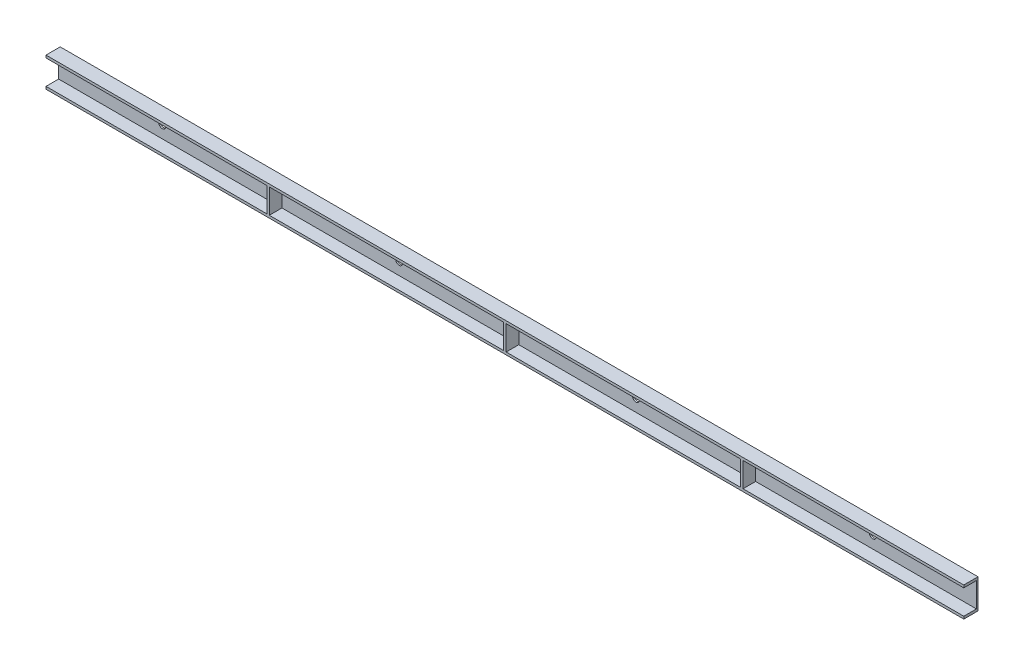
ISO-10303-21;
HEADER;
FILE_DESCRIPTION(('STEP AP214'),'2;1');
FILE_NAME('part.step','',(''),(''),'','','');
FILE_SCHEMA(('AUTOMOTIVE_DESIGN { 1 0 10303 214 1 1 1 1 }'));
ENDSEC;
DATA;
#1=APPLICATION_CONTEXT('core data for automotive mechanical design processes');
#2=APPLICATION_PROTOCOL_DEFINITION('international standard','automotive_design',2000,#1);
#3=PRODUCT_CONTEXT('',#1,'mechanical');
#4=PRODUCT('Part','Part','',(#3));
#5=PRODUCT_RELATED_PRODUCT_CATEGORY('part','',(#4));
#6=PRODUCT_DEFINITION_FORMATION('','',#4);
#7=PRODUCT_DEFINITION_CONTEXT('part definition',#1,'design');
#8=PRODUCT_DEFINITION('design','',#6,#7);
#9=PRODUCT_DEFINITION_SHAPE('','',#8);
#10=(LENGTH_UNIT() NAMED_UNIT(*) SI_UNIT(.MILLI.,.METRE.));
#11=(NAMED_UNIT(*) PLANE_ANGLE_UNIT() SI_UNIT($,.RADIAN.));
#12=(NAMED_UNIT(*) SI_UNIT($,.STERADIAN.) SOLID_ANGLE_UNIT());
#13=UNCERTAINTY_MEASURE_WITH_UNIT(LENGTH_MEASURE(1.E-05),#10,'distance_accuracy_value','');
#14=(GEOMETRIC_REPRESENTATION_CONTEXT(3) GLOBAL_UNCERTAINTY_ASSIGNED_CONTEXT((#13)) GLOBAL_UNIT_ASSIGNED_CONTEXT((#10,
#11,#12)) REPRESENTATION_CONTEXT('',''));
#15=CARTESIAN_POINT('',(0.,0.,0.));
#16=DIRECTION('',(0.,0.,1.));
#17=DIRECTION('',(1.,0.,0.));
#18=AXIS2_PLACEMENT_3D('',#15,#16,#17);
#19=CARTESIAN_POINT('',(0.,91.5,5.3));
#20=DIRECTION('',(0.,1.,0.));
#21=DIRECTION('',(0.,0.,1.));
#22=AXIS2_PLACEMENT_3D('',#19,#20,#21);
#23=PLANE('',#22);
#24=DIRECTION('',(-1.,0.,0.));
#25=VECTOR('',#24,1.);
#26=CARTESIAN_POINT('',(0.,91.5,5.3));
#27=LINE('',#26,#25);
#28=CARTESIAN_POINT('',(3700.,91.5,5.3));
#29=VERTEX_POINT('',#28);
#30=CARTESIAN_POINT('',(2954.25,91.5,5.3));
#31=VERTEX_POINT('',#30);
#32=EDGE_CURVE('E198',#29,#31,#27,.T.);
#33=ORIENTED_EDGE('',*,*,#32,.F.);
#34=DIRECTION('',(0.,0.,1.));
#35=VECTOR('',#34,1.);
#36=CARTESIAN_POINT('',(3700.,91.5,5.3));
#37=LINE('',#36,#35);
#38=CARTESIAN_POINT('',(3700.,91.5,48.));
#39=VERTEX_POINT('',#38);
#40=EDGE_CURVE('E347',#29,#39,#37,.T.);
#41=ORIENTED_EDGE('',*,*,#40,.T.);
#42=DIRECTION('',(-1.,0.,0.));
#43=VECTOR('',#42,1.);
#44=CARTESIAN_POINT('',(0.,91.5,48.));
#45=LINE('',#44,#43);
#46=CARTESIAN_POINT('',(2954.25,91.5,48.));
#47=VERTEX_POINT('',#46);
#48=EDGE_CURVE('E196',#39,#47,#45,.T.);
#49=ORIENTED_EDGE('',*,*,#48,.T.);
#50=DIRECTION('',(0.,0.,-1.));
#51=VECTOR('',#50,1.);
#52=CARTESIAN_POINT('',(2954.25,91.5,48.));
#53=LINE('',#52,#51);
#54=EDGE_CURVE('E293',#47,#31,#53,.T.);
#55=ORIENTED_EDGE('',*,*,#54,.T.);
#56=EDGE_LOOP('',(#33,#41,#49,#55));
#57=FACE_BOUND('',#56,.T.);
#58=ADVANCED_FACE('F32',(#57),#23,.F.);
#59=CARTESIAN_POINT('',(0.,8.50000000000001,5.3));
#60=DIRECTION('',(0.,-1.,0.));
#61=DIRECTION('',(1.,0.,0.));
#62=AXIS2_PLACEMENT_3D('',#59,#60,#61);
#63=PLANE('',#62);
#64=DIRECTION('',(1.,0.,0.));
#65=VECTOR('',#64,1.);
#66=CARTESIAN_POINT('',(0.,8.50000000000001,48.));
#67=LINE('',#66,#65);
#68=CARTESIAN_POINT('',(2954.25,8.5,48.));
#69=VERTEX_POINT('',#68);
#70=CARTESIAN_POINT('',(3700.,8.50000000000001,48.));
#71=VERTEX_POINT('',#70);
#72=EDGE_CURVE('E236',#69,#71,#67,.T.);
#73=ORIENTED_EDGE('',*,*,#72,.T.);
#74=DIRECTION('',(0.,0.,-1.));
#75=VECTOR('',#74,1.);
#76=CARTESIAN_POINT('',(3700.,8.5,5.3));
#77=LINE('',#76,#75);
#78=CARTESIAN_POINT('',(3700.,8.5,5.3));
#79=VERTEX_POINT('',#78);
#80=EDGE_CURVE('E172',#71,#79,#77,.T.);
#81=ORIENTED_EDGE('',*,*,#80,.T.);
#82=DIRECTION('',(1.,0.,0.));
#83=VECTOR('',#82,1.);
#84=CARTESIAN_POINT('',(0.,8.50000000000001,5.3));
#85=LINE('',#84,#83);
#86=CARTESIAN_POINT('',(2954.25,8.5,5.3));
#87=VERTEX_POINT('',#86);
#88=EDGE_CURVE('E214',#87,#79,#85,.T.);
#89=ORIENTED_EDGE('',*,*,#88,.F.);
#90=DIRECTION('',(0.,0.,-1.));
#91=VECTOR('',#90,1.);
#92=CARTESIAN_POINT('',(2954.25,8.50000000000001,48.));
#93=LINE('',#92,#91);
#94=EDGE_CURVE('E290',#69,#87,#93,.T.);
#95=ORIENTED_EDGE('',*,*,#94,.F.);
#96=EDGE_LOOP('',(#73,#81,#89,#95));
#97=FACE_BOUND('',#96,.T.);
#98=ADVANCED_FACE('F391',(#97),#63,.F.);
#99=CARTESIAN_POINT('',(0.,8.50000000000001,5.3));
#100=DIRECTION('',(0.,0.,1.));
#101=DIRECTION('',(1.,0.,0.));
#102=AXIS2_PLACEMENT_3D('',#99,#100,#101);
#103=PLANE('',#102);
#104=DIRECTION('',(0.,-1.,0.));
#105=VECTOR('',#104,1.);
#106=CARTESIAN_POINT('',(3700.,8.50000000000001,5.3));
#107=LINE('',#106,#105);
#108=EDGE_CURVE('E177',#29,#79,#107,.T.);
#109=ORIENTED_EDGE('',*,*,#108,.F.);
#110=ORIENTED_EDGE('',*,*,#32,.T.);
#111=DIRECTION('',(0.,1.,0.));
#112=VECTOR('',#111,1.);
#113=CARTESIAN_POINT('',(2954.25,91.5,5.3));
#114=LINE('',#113,#112);
#115=EDGE_CURVE('E299',#87,#31,#114,.T.);
#116=ORIENTED_EDGE('',*,*,#115,.F.);
#117=ORIENTED_EDGE('',*,*,#88,.T.);
#118=EDGE_LOOP('',(#109,#110,#116,#117));
#119=FACE_BOUND('',#118,.T.);
#120=CARTESIAN_POINT('',(3350.,50.,5.3));
#121=DIRECTION('',(0.,0.,1.));
#122=DIRECTION('',(1.,0.,0.));
#123=AXIS2_PLACEMENT_3D('',#120,#121,#122);
#124=CIRCLE('',#123,11.4999999999997);
#125=CARTESIAN_POINT('',(3361.5,50.,5.3));
#126=VERTEX_POINT('',#125);
#127=EDGE_CURVE('E306',#126,#126,#124,.T.);
#128=ORIENTED_EDGE('',*,*,#127,.F.);
#129=EDGE_LOOP('',(#128));
#130=FACE_BOUND('',#129,.T.);
#131=ADVANCED_FACE('F398',(#119,#130),#103,.T.);
#132=DIRECTION('',(0.,0.,-1.));
#133=VECTOR('',#132,1.);
#134=CARTESIAN_POINT('',(2945.75,91.5,48.));
#135=LINE('',#134,#133);
#136=CARTESIAN_POINT('',(2945.75,91.5,48.));
#137=VERTEX_POINT('',#136);
#138=CARTESIAN_POINT('',(2945.75,91.5,5.3));
#139=VERTEX_POINT('',#138);
#140=EDGE_CURVE('E295',#137,#139,#135,.T.);
#141=ORIENTED_EDGE('',*,*,#140,.F.);
#142=CARTESIAN_POINT('',(2154.25,91.5,48.));
#143=VERTEX_POINT('',#142);
#144=EDGE_CURVE('E223',#137,#143,#45,.T.);
#145=ORIENTED_EDGE('',*,*,#144,.T.);
#146=DIRECTION('',(0.,0.,-1.));
#147=VECTOR('',#146,1.);
#148=CARTESIAN_POINT('',(2154.25,91.5,48.));
#149=LINE('',#148,#147);
#150=CARTESIAN_POINT('',(2154.25,91.5,5.3));
#151=VERTEX_POINT('',#150);
#152=EDGE_CURVE('E270',#143,#151,#149,.T.);
#153=ORIENTED_EDGE('',*,*,#152,.T.);
#154=EDGE_CURVE('E199',#139,#151,#27,.T.);
#155=ORIENTED_EDGE('',*,*,#154,.F.);
#156=EDGE_LOOP('',(#141,#145,#153,#155));
#157=FACE_BOUND('',#156,.T.);
#158=ADVANCED_FACE('F393',(#157),#23,.F.);
#159=DIRECTION('',(0.,0.,-1.));
#160=VECTOR('',#159,1.);
#161=CARTESIAN_POINT('',(2945.75,8.50000000000001,48.));
#162=LINE('',#161,#160);
#163=CARTESIAN_POINT('',(2945.75,8.5,48.));
#164=VERTEX_POINT('',#163);
#165=CARTESIAN_POINT('',(2945.75,8.5,5.3));
#166=VERTEX_POINT('',#165);
#167=EDGE_CURVE('E284',#164,#166,#162,.T.);
#168=ORIENTED_EDGE('',*,*,#167,.T.);
#169=CARTESIAN_POINT('',(2154.25,8.5,5.3));
#170=VERTEX_POINT('',#169);
#171=EDGE_CURVE('E218',#170,#166,#85,.T.);
#172=ORIENTED_EDGE('',*,*,#171,.F.);
#173=DIRECTION('',(0.,0.,-1.));
#174=VECTOR('',#173,1.);
#175=CARTESIAN_POINT('',(2154.25,8.50000000000001,48.));
#176=LINE('',#175,#174);
#177=CARTESIAN_POINT('',(2154.25,8.5,48.));
#178=VERTEX_POINT('',#177);
#179=EDGE_CURVE('E267',#178,#170,#176,.T.);
#180=ORIENTED_EDGE('',*,*,#179,.F.);
#181=EDGE_CURVE('E240',#178,#164,#67,.T.);
#182=ORIENTED_EDGE('',*,*,#181,.T.);
#183=EDGE_LOOP('',(#168,#172,#180,#182));
#184=FACE_BOUND('',#183,.T.);
#185=ADVANCED_FACE('F400',(#184),#63,.F.);
#186=CARTESIAN_POINT('',(2550.,50.,5.3));
#187=DIRECTION('',(0.,0.,1.));
#188=DIRECTION('',(1.,0.,0.));
#189=AXIS2_PLACEMENT_3D('',#186,#187,#188);
#190=CIRCLE('',#189,11.4999999999997);
#191=CARTESIAN_POINT('',(2561.5,50.,5.3));
#192=VERTEX_POINT('',#191);
#193=EDGE_CURVE('E315',#192,#192,#190,.T.);
#194=ORIENTED_EDGE('',*,*,#193,.F.);
#195=EDGE_LOOP('',(#194));
#196=FACE_BOUND('',#195,.T.);
#197=ORIENTED_EDGE('',*,*,#171,.T.);
#198=DIRECTION('',(0.,-1.,0.));
#199=VECTOR('',#198,1.);
#200=CARTESIAN_POINT('',(2945.75,91.5,5.3));
#201=LINE('',#200,#199);
#202=EDGE_CURVE('E303',#139,#166,#201,.T.);
#203=ORIENTED_EDGE('',*,*,#202,.F.);
#204=ORIENTED_EDGE('',*,*,#154,.T.);
#205=DIRECTION('',(0.,1.,0.));
#206=VECTOR('',#205,1.);
#207=CARTESIAN_POINT('',(2154.25,91.5,5.3));
#208=LINE('',#207,#206);
#209=EDGE_CURVE('E277',#170,#151,#208,.T.);
#210=ORIENTED_EDGE('',*,*,#209,.F.);
#211=EDGE_LOOP('',(#197,#203,#204,#210));
#212=FACE_BOUND('',#211,.T.);
#213=ADVANCED_FACE('F415',(#196,#212),#103,.T.);
#214=DIRECTION('',(0.,0.,-1.));
#215=VECTOR('',#214,1.);
#216=CARTESIAN_POINT('',(2145.75,91.5,48.));
#217=LINE('',#216,#215);
#218=CARTESIAN_POINT('',(2145.75,91.5,48.));
#219=VERTEX_POINT('',#218);
#220=CARTESIAN_POINT('',(2145.75,91.5,5.3));
#221=VERTEX_POINT('',#220);
#222=EDGE_CURVE('E273',#219,#221,#217,.T.);
#223=ORIENTED_EDGE('',*,*,#222,.F.);
#224=CARTESIAN_POINT('',(1354.25,91.5,48.));
#225=VERTEX_POINT('',#224);
#226=EDGE_CURVE('E229',#219,#225,#45,.T.);
#227=ORIENTED_EDGE('',*,*,#226,.T.);
#228=DIRECTION('',(0.,0.,-1.));
#229=VECTOR('',#228,1.);
#230=CARTESIAN_POINT('',(1354.25,91.5,48.));
#231=LINE('',#230,#229);
#232=CARTESIAN_POINT('',(1354.25,91.5,5.3));
#233=VERTEX_POINT('',#232);
#234=EDGE_CURVE('E247',#225,#233,#231,.T.);
#235=ORIENTED_EDGE('',*,*,#234,.T.);
#236=EDGE_CURVE('E206',#221,#233,#27,.T.);
#237=ORIENTED_EDGE('',*,*,#236,.F.);
#238=EDGE_LOOP('',(#223,#227,#235,#237));
#239=FACE_BOUND('',#238,.T.);
#240=ADVANCED_FACE('F405',(#239),#23,.F.);
#241=DIRECTION('',(0.,0.,-1.));
#242=VECTOR('',#241,1.);
#243=CARTESIAN_POINT('',(2145.75,8.50000000000001,48.));
#244=LINE('',#243,#242);
#245=CARTESIAN_POINT('',(2145.75,8.5,48.));
#246=VERTEX_POINT('',#245);
#247=CARTESIAN_POINT('',(2145.75,8.5,5.3));
#248=VERTEX_POINT('',#247);
#249=EDGE_CURVE('E262',#246,#248,#244,.T.);
#250=ORIENTED_EDGE('',*,*,#249,.T.);
#251=CARTESIAN_POINT('',(1354.25,8.50000000000001,5.3));
#252=VERTEX_POINT('',#251);
#253=EDGE_CURVE('E213',#252,#248,#85,.T.);
#254=ORIENTED_EDGE('',*,*,#253,.F.);
#255=DIRECTION('',(0.,0.,-1.));
#256=VECTOR('',#255,1.);
#257=CARTESIAN_POINT('',(1354.25,8.50000000000001,48.));
#258=LINE('',#257,#256);
#259=CARTESIAN_POINT('',(1354.25,8.50000000000001,48.));
#260=VERTEX_POINT('',#259);
#261=EDGE_CURVE('E243',#260,#252,#258,.T.);
#262=ORIENTED_EDGE('',*,*,#261,.F.);
#263=EDGE_CURVE('E235',#260,#246,#67,.T.);
#264=ORIENTED_EDGE('',*,*,#263,.T.);
#265=EDGE_LOOP('',(#250,#254,#262,#264));
#266=FACE_BOUND('',#265,.T.);
#267=ADVANCED_FACE('F413',(#266),#63,.F.);
#268=CARTESIAN_POINT('',(1750.,50.,5.3));
#269=DIRECTION('',(0.,0.,1.));
#270=DIRECTION('',(1.,0.,0.));
#271=AXIS2_PLACEMENT_3D('',#268,#269,#270);
#272=CIRCLE('',#271,11.4999999999997);
#273=CARTESIAN_POINT('',(1761.5,50.,5.3));
#274=VERTEX_POINT('',#273);
#275=EDGE_CURVE('E321',#274,#274,#272,.T.);
#276=ORIENTED_EDGE('',*,*,#275,.F.);
#277=EDGE_LOOP('',(#276));
#278=FACE_BOUND('',#277,.T.);
#279=ORIENTED_EDGE('',*,*,#253,.T.);
#280=DIRECTION('',(0.,-1.,0.));
#281=VECTOR('',#280,1.);
#282=CARTESIAN_POINT('',(2145.75,91.5,5.3));
#283=LINE('',#282,#281);
#284=EDGE_CURVE('E281',#221,#248,#283,.T.);
#285=ORIENTED_EDGE('',*,*,#284,.F.);
#286=ORIENTED_EDGE('',*,*,#236,.T.);
#287=DIRECTION('',(0.,1.,0.));
#288=VECTOR('',#287,1.);
#289=CARTESIAN_POINT('',(1354.25,91.5,5.3));
#290=LINE('',#289,#288);
#291=EDGE_CURVE('E256',#252,#233,#290,.T.);
#292=ORIENTED_EDGE('',*,*,#291,.F.);
#293=EDGE_LOOP('',(#279,#285,#286,#292));
#294=FACE_BOUND('',#293,.T.);
#295=ADVANCED_FACE('F407',(#278,#294),#103,.T.);
#296=CARTESIAN_POINT('',(1345.75,91.5,48.));
#297=VERTEX_POINT('',#296);
#298=CARTESIAN_POINT('',(600.,91.5,48.));
#299=VERTEX_POINT('',#298);
#300=EDGE_CURVE('E224',#297,#299,#45,.T.);
#301=ORIENTED_EDGE('',*,*,#300,.T.);
#302=DIRECTION('',(0.,0.,-1.));
#303=VECTOR('',#302,1.);
#304=CARTESIAN_POINT('',(600.,91.5,5.3));
#305=LINE('',#304,#303);
#306=CARTESIAN_POINT('',(600.,91.5,5.3));
#307=VERTEX_POINT('',#306);
#308=EDGE_CURVE('E333',#299,#307,#305,.T.);
#309=ORIENTED_EDGE('',*,*,#308,.T.);
#310=CARTESIAN_POINT('',(1345.75,91.5,5.3));
#311=VERTEX_POINT('',#310);
#312=EDGE_CURVE('E201',#311,#307,#27,.T.);
#313=ORIENTED_EDGE('',*,*,#312,.F.);
#314=DIRECTION('',(0.,0.,-1.));
#315=VECTOR('',#314,1.);
#316=CARTESIAN_POINT('',(1345.75,91.5,48.));
#317=LINE('',#316,#315);
#318=EDGE_CURVE('E252',#297,#311,#317,.T.);
#319=ORIENTED_EDGE('',*,*,#318,.F.);
#320=EDGE_LOOP('',(#301,#309,#313,#319));
#321=FACE_BOUND('',#320,.T.);
#322=ADVANCED_FACE('F394',(#321),#23,.F.);
#323=CARTESIAN_POINT('',(600.,8.50000000000001,5.3));
#324=VERTEX_POINT('',#323);
#325=CARTESIAN_POINT('',(1345.75,8.50000000000001,5.3));
#326=VERTEX_POINT('',#325);
#327=EDGE_CURVE('E209',#324,#326,#85,.T.);
#328=ORIENTED_EDGE('',*,*,#327,.F.);
#329=DIRECTION('',(0.,0.,1.));
#330=VECTOR('',#329,1.);
#331=CARTESIAN_POINT('',(600.,8.50000000000001,5.3));
#332=LINE('',#331,#330);
#333=CARTESIAN_POINT('',(600.,8.50000000000001,48.));
#334=VERTEX_POINT('',#333);
#335=EDGE_CURVE('E335',#324,#334,#332,.T.);
#336=ORIENTED_EDGE('',*,*,#335,.T.);
#337=CARTESIAN_POINT('',(1345.75,8.50000000000001,48.));
#338=VERTEX_POINT('',#337);
#339=EDGE_CURVE('E231',#334,#338,#67,.T.);
#340=ORIENTED_EDGE('',*,*,#339,.T.);
#341=DIRECTION('',(0.,0.,-1.));
#342=VECTOR('',#341,1.);
#343=CARTESIAN_POINT('',(1345.75,8.50000000000001,48.));
#344=LINE('',#343,#342);
#345=EDGE_CURVE('E241',#338,#326,#344,.T.);
#346=ORIENTED_EDGE('',*,*,#345,.T.);
#347=EDGE_LOOP('',(#328,#336,#340,#346));
#348=FACE_BOUND('',#347,.T.);
#349=ADVANCED_FACE('F401',(#348),#63,.F.);
#350=DIRECTION('',(0.,1.,0.));
#351=VECTOR('',#350,1.);
#352=CARTESIAN_POINT('',(600.,8.50000000000001,5.3));
#353=LINE('',#352,#351);
#354=EDGE_CURVE('E337',#324,#307,#353,.T.);
#355=ORIENTED_EDGE('',*,*,#354,.F.);
#356=ORIENTED_EDGE('',*,*,#327,.T.);
#357=DIRECTION('',(0.,-1.,0.));
#358=VECTOR('',#357,1.);
#359=CARTESIAN_POINT('',(1345.75,91.5,5.3));
#360=LINE('',#359,#358);
#361=EDGE_CURVE('E260',#311,#326,#360,.T.);
#362=ORIENTED_EDGE('',*,*,#361,.F.);
#363=ORIENTED_EDGE('',*,*,#312,.T.);
#364=EDGE_LOOP('',(#355,#356,#362,#363));
#365=FACE_BOUND('',#364,.T.);
#366=CARTESIAN_POINT('',(949.999999999998,50.,5.3));
#367=DIRECTION('',(0.,0.,1.));
#368=DIRECTION('',(1.,0.,0.));
#369=AXIS2_PLACEMENT_3D('',#366,#367,#368);
#370=CIRCLE('',#369,11.4999999999997);
#371=CARTESIAN_POINT('',(961.499999999998,50.,5.3));
#372=VERTEX_POINT('',#371);
#373=EDGE_CURVE('E327',#372,#372,#370,.T.);
#374=ORIENTED_EDGE('',*,*,#373,.F.);
#375=EDGE_LOOP('',(#374));
#376=FACE_BOUND('',#375,.T.);
#377=ADVANCED_FACE('F412',(#365,#376),#103,.T.);
#378=CARTESIAN_POINT('',(0.,0.,48.));
#379=DIRECTION('',(0.,1.,0.));
#380=DIRECTION('',(0.,0.,1.));
#381=AXIS2_PLACEMENT_3D('',#378,#379,#380);
#382=PLANE('',#381);
#383=DIRECTION('',(1.,0.,0.));
#384=VECTOR('',#383,1.);
#385=CARTESIAN_POINT('',(0.,0.,0.));
#386=LINE('',#385,#384);
#387=CARTESIAN_POINT('',(600.,0.,0.));
#388=VERTEX_POINT('',#387);
#389=CARTESIAN_POINT('',(3700.,0.,0.));
#390=VERTEX_POINT('',#389);
#391=EDGE_CURVE('E185',#388,#390,#386,.T.);
#392=ORIENTED_EDGE('',*,*,#391,.T.);
#393=DIRECTION('',(0.,0.,1.));
#394=VECTOR('',#393,1.);
#395=CARTESIAN_POINT('',(3700.,0.,48.));
#396=LINE('',#395,#394);
#397=CARTESIAN_POINT('',(3700.,0.,48.));
#398=VERTEX_POINT('',#397);
#399=EDGE_CURVE('E49',#390,#398,#396,.T.);
#400=ORIENTED_EDGE('',*,*,#399,.T.);
#401=DIRECTION('',(1.,0.,0.));
#402=VECTOR('',#401,1.);
#403=CARTESIAN_POINT('',(0.,0.,48.));
#404=LINE('',#403,#402);
#405=CARTESIAN_POINT('',(600.,0.,48.));
#406=VERTEX_POINT('',#405);
#407=EDGE_CURVE('E41',#406,#398,#404,.T.);
#408=ORIENTED_EDGE('',*,*,#407,.F.);
#409=DIRECTION('',(0.,0.,-1.));
#410=VECTOR('',#409,1.);
#411=CARTESIAN_POINT('',(600.,0.,0.));
#412=LINE('',#411,#410);
#413=EDGE_CURVE('E346',#406,#388,#412,.T.);
#414=ORIENTED_EDGE('',*,*,#413,.T.);
#415=EDGE_LOOP('',(#392,#400,#408,#414));
#416=FACE_BOUND('',#415,.T.);
#417=ADVANCED_FACE('F34',(#416),#382,.F.);
#418=CARTESIAN_POINT('',(0.,100.,48.));
#419=DIRECTION('',(0.,-1.,0.));
#420=DIRECTION('',(0.,0.,-1.));
#421=AXIS2_PLACEMENT_3D('',#418,#419,#420);
#422=PLANE('',#421);
#423=DIRECTION('',(-1.,0.,0.));
#424=VECTOR('',#423,1.);
#425=CARTESIAN_POINT('',(0.,100.,48.));
#426=LINE('',#425,#424);
#427=CARTESIAN_POINT('',(3700.,100.,48.));
#428=VERTEX_POINT('',#427);
#429=CARTESIAN_POINT('',(600.,100.,48.));
#430=VERTEX_POINT('',#429);
#431=EDGE_CURVE('E11',#428,#430,#426,.T.);
#432=ORIENTED_EDGE('',*,*,#431,.F.);
#433=DIRECTION('',(0.,0.,1.));
#434=VECTOR('',#433,1.);
#435=CARTESIAN_POINT('',(3700.,100.,48.));
#436=LINE('',#435,#434);
#437=CARTESIAN_POINT('',(3700.,100.,0.));
#438=VERTEX_POINT('',#437);
#439=EDGE_CURVE('E187',#438,#428,#436,.T.);
#440=ORIENTED_EDGE('',*,*,#439,.F.);
#441=DIRECTION('',(-1.,0.,0.));
#442=VECTOR('',#441,1.);
#443=CARTESIAN_POINT('',(0.,100.,0.));
#444=LINE('',#443,#442);
#445=CARTESIAN_POINT('',(600.,100.,0.));
#446=VERTEX_POINT('',#445);
#447=EDGE_CURVE('E36',#438,#446,#444,.T.);
#448=ORIENTED_EDGE('',*,*,#447,.T.);
#449=DIRECTION('',(0.,0.,-1.));
#450=VECTOR('',#449,1.);
#451=CARTESIAN_POINT('',(600.,100.,0.));
#452=LINE('',#451,#450);
#453=EDGE_CURVE('E344',#430,#446,#452,.T.);
#454=ORIENTED_EDGE('',*,*,#453,.F.);
#455=EDGE_LOOP('',(#432,#440,#448,#454));
#456=FACE_BOUND('',#455,.T.);
#457=ADVANCED_FACE('F357',(#456),#422,.F.);
#458=CARTESIAN_POINT('',(0.,100.,48.));
#459=DIRECTION('',(0.,0.,-1.));
#460=DIRECTION('',(-1.,0.,0.));
#461=AXIS2_PLACEMENT_3D('',#458,#459,#460);
#462=PLANE('',#461);
#463=ORIENTED_EDGE('',*,*,#407,.T.);
#464=DIRECTION('',(0.,1.,0.));
#465=VECTOR('',#464,1.);
#466=CARTESIAN_POINT('',(3700.,0.,48.));
#467=LINE('',#466,#465);
#468=EDGE_CURVE('E169',#398,#71,#467,.T.);
#469=ORIENTED_EDGE('',*,*,#468,.T.);
#470=ORIENTED_EDGE('',*,*,#72,.F.);
#471=DIRECTION('',(0.,1.,0.));
#472=VECTOR('',#471,1.);
#473=CARTESIAN_POINT('',(2954.25,91.5,48.));
#474=LINE('',#473,#472);
#475=EDGE_CURVE('E298',#69,#47,#474,.T.);
#476=ORIENTED_EDGE('',*,*,#475,.T.);
#477=ORIENTED_EDGE('',*,*,#48,.F.);
#478=EDGE_CURVE('E178',#39,#428,#467,.T.);
#479=ORIENTED_EDGE('',*,*,#478,.T.);
#480=ORIENTED_EDGE('',*,*,#431,.T.);
#481=DIRECTION('',(0.,1.,0.));
#482=VECTOR('',#481,1.);
#483=CARTESIAN_POINT('',(600.,0.,48.));
#484=LINE('',#483,#482);
#485=EDGE_CURVE('E341',#299,#430,#484,.T.);
#486=ORIENTED_EDGE('',*,*,#485,.F.);
#487=ORIENTED_EDGE('',*,*,#300,.F.);
#488=DIRECTION('',(0.,-1.,0.));
#489=VECTOR('',#488,1.);
#490=CARTESIAN_POINT('',(1345.75,91.5,48.));
#491=LINE('',#490,#489);
#492=EDGE_CURVE('E259',#297,#338,#491,.T.);
#493=ORIENTED_EDGE('',*,*,#492,.T.);
#494=ORIENTED_EDGE('',*,*,#339,.F.);
#495=EDGE_CURVE('E193',#406,#334,#484,.T.);
#496=ORIENTED_EDGE('',*,*,#495,.F.);
#497=EDGE_LOOP('',(#463,#469,#470,#476,#477,#479,#480,#486,#487,#493,#494,#496));
#498=FACE_BOUND('',#497,.T.);
#499=ORIENTED_EDGE('',*,*,#181,.F.);
#500=DIRECTION('',(0.,1.,0.));
#501=VECTOR('',#500,1.);
#502=CARTESIAN_POINT('',(2154.25,91.5,48.));
#503=LINE('',#502,#501);
#504=EDGE_CURVE('E276',#178,#143,#503,.T.);
#505=ORIENTED_EDGE('',*,*,#504,.T.);
#506=ORIENTED_EDGE('',*,*,#144,.F.);
#507=DIRECTION('',(0.,-1.,0.));
#508=VECTOR('',#507,1.);
#509=CARTESIAN_POINT('',(2945.75,91.5,48.));
#510=LINE('',#509,#508);
#511=EDGE_CURVE('E302',#137,#164,#510,.T.);
#512=ORIENTED_EDGE('',*,*,#511,.T.);
#513=EDGE_LOOP('',(#499,#505,#506,#512));
#514=FACE_BOUND('',#513,.T.);
#515=ORIENTED_EDGE('',*,*,#263,.F.);
#516=DIRECTION('',(0.,1.,0.));
#517=VECTOR('',#516,1.);
#518=CARTESIAN_POINT('',(1354.25,91.5,48.));
#519=LINE('',#518,#517);
#520=EDGE_CURVE('E255',#260,#225,#519,.T.);
#521=ORIENTED_EDGE('',*,*,#520,.T.);
#522=ORIENTED_EDGE('',*,*,#226,.F.);
#523=DIRECTION('',(0.,-1.,0.));
#524=VECTOR('',#523,1.);
#525=CARTESIAN_POINT('',(2145.75,91.5,48.));
#526=LINE('',#525,#524);
#527=EDGE_CURVE('E280',#219,#246,#526,.T.);
#528=ORIENTED_EDGE('',*,*,#527,.T.);
#529=EDGE_LOOP('',(#515,#521,#522,#528));
#530=FACE_BOUND('',#529,.T.);
#531=ADVANCED_FACE('F190',(#498,#514,#530),#462,.F.);
#532=CARTESIAN_POINT('',(0.,100.,0.));
#533=DIRECTION('',(0.,0.,-1.));
#534=DIRECTION('',(-1.,0.,0.));
#535=AXIS2_PLACEMENT_3D('',#532,#533,#534);
#536=PLANE('',#535);
#537=DIRECTION('',(0.,1.,0.));
#538=VECTOR('',#537,1.);
#539=CARTESIAN_POINT('',(3700.,0.,0.));
#540=LINE('',#539,#538);
#541=EDGE_CURVE('E186',#390,#438,#540,.T.);
#542=ORIENTED_EDGE('',*,*,#541,.F.);
#543=ORIENTED_EDGE('',*,*,#391,.F.);
#544=DIRECTION('',(0.,1.,0.));
#545=VECTOR('',#544,1.);
#546=CARTESIAN_POINT('',(600.,0.,0.));
#547=LINE('',#546,#545);
#548=EDGE_CURVE('E339',#388,#446,#547,.T.);
#549=ORIENTED_EDGE('',*,*,#548,.T.);
#550=ORIENTED_EDGE('',*,*,#447,.F.);
#551=EDGE_LOOP('',(#542,#543,#549,#550));
#552=FACE_BOUND('',#551,.T.);
#553=CARTESIAN_POINT('',(949.999999999998,50.,0.));
#554=DIRECTION('',(0.,0.,-1.));
#555=DIRECTION('',(-1.,0.,0.));
#556=AXIS2_PLACEMENT_3D('',#553,#554,#555);
#557=CIRCLE('',#556,11.4999999999997);
#558=CARTESIAN_POINT('',(938.499999999999,50.,0.));
#559=VERTEX_POINT('',#558);
#560=EDGE_CURVE('E330',#559,#559,#557,.T.);
#561=ORIENTED_EDGE('',*,*,#560,.F.);
#562=EDGE_LOOP('',(#561));
#563=FACE_BOUND('',#562,.T.);
#564=CARTESIAN_POINT('',(1750.,50.,0.));
#565=DIRECTION('',(0.,0.,-1.));
#566=DIRECTION('',(-1.,0.,0.));
#567=AXIS2_PLACEMENT_3D('',#564,#565,#566);
#568=CIRCLE('',#567,11.4999999999997);
#569=CARTESIAN_POINT('',(1738.5,50.,0.));
#570=VERTEX_POINT('',#569);
#571=EDGE_CURVE('E324',#570,#570,#568,.T.);
#572=ORIENTED_EDGE('',*,*,#571,.F.);
#573=EDGE_LOOP('',(#572));
#574=FACE_BOUND('',#573,.T.);
#575=CARTESIAN_POINT('',(2550.,50.,0.));
#576=DIRECTION('',(0.,0.,-1.));
#577=DIRECTION('',(-1.,0.,0.));
#578=AXIS2_PLACEMENT_3D('',#575,#576,#577);
#579=CIRCLE('',#578,11.4999999999997);
#580=CARTESIAN_POINT('',(2538.5,50.,0.));
#581=VERTEX_POINT('',#580);
#582=EDGE_CURVE('E318',#581,#581,#579,.T.);
#583=ORIENTED_EDGE('',*,*,#582,.F.);
#584=EDGE_LOOP('',(#583));
#585=FACE_BOUND('',#584,.T.);
#586=CARTESIAN_POINT('',(3350.,50.,0.));
#587=DIRECTION('',(0.,0.,-1.));
#588=DIRECTION('',(-1.,0.,0.));
#589=AXIS2_PLACEMENT_3D('',#586,#587,#588);
#590=CIRCLE('',#589,11.4999999999997);
#591=CARTESIAN_POINT('',(3338.5,50.,0.));
#592=VERTEX_POINT('',#591);
#593=EDGE_CURVE('E312',#592,#592,#590,.T.);
#594=ORIENTED_EDGE('',*,*,#593,.F.);
#595=EDGE_LOOP('',(#594));
#596=FACE_BOUND('',#595,.T.);
#597=ADVANCED_FACE('F361',(#552,#563,#574,#585,#596),#536,.T.);
#598=CARTESIAN_POINT('',(1345.75,91.5,48.));
#599=DIRECTION('',(1.,0.,0.));
#600=DIRECTION('',(0.,0.,-1.));
#601=AXIS2_PLACEMENT_3D('',#598,#599,#600);
#602=PLANE('',#601);
#603=ORIENTED_EDGE('',*,*,#361,.T.);
#604=ORIENTED_EDGE('',*,*,#345,.F.);
#605=ORIENTED_EDGE('',*,*,#492,.F.);
#606=ORIENTED_EDGE('',*,*,#318,.T.);
#607=EDGE_LOOP('',(#603,#604,#605,#606));
#608=FACE_BOUND('',#607,.T.);
#609=ADVANCED_FACE('F364',(#608),#602,.F.);
#610=CARTESIAN_POINT('',(1354.25,91.5,48.));
#611=DIRECTION('',(-1.,0.,0.));
#612=DIRECTION('',(0.,0.,1.));
#613=AXIS2_PLACEMENT_3D('',#610,#611,#612);
#614=PLANE('',#613);
#615=ORIENTED_EDGE('',*,*,#291,.T.);
#616=ORIENTED_EDGE('',*,*,#234,.F.);
#617=ORIENTED_EDGE('',*,*,#520,.F.);
#618=ORIENTED_EDGE('',*,*,#261,.T.);
#619=EDGE_LOOP('',(#615,#616,#617,#618));
#620=FACE_BOUND('',#619,.T.);
#621=ADVANCED_FACE('F435',(#620),#614,.F.);
#622=CARTESIAN_POINT('',(2145.75,91.5,48.));
#623=DIRECTION('',(1.,0.,0.));
#624=DIRECTION('',(0.,0.,-1.));
#625=AXIS2_PLACEMENT_3D('',#622,#623,#624);
#626=PLANE('',#625);
#627=ORIENTED_EDGE('',*,*,#284,.T.);
#628=ORIENTED_EDGE('',*,*,#249,.F.);
#629=ORIENTED_EDGE('',*,*,#527,.F.);
#630=ORIENTED_EDGE('',*,*,#222,.T.);
#631=EDGE_LOOP('',(#627,#628,#629,#630));
#632=FACE_BOUND('',#631,.T.);
#633=ADVANCED_FACE('F429',(#632),#626,.F.);
#634=CARTESIAN_POINT('',(2154.25,91.5,48.));
#635=DIRECTION('',(-1.,0.,0.));
#636=DIRECTION('',(0.,0.,1.));
#637=AXIS2_PLACEMENT_3D('',#634,#635,#636);
#638=PLANE('',#637);
#639=ORIENTED_EDGE('',*,*,#209,.T.);
#640=ORIENTED_EDGE('',*,*,#152,.F.);
#641=ORIENTED_EDGE('',*,*,#504,.F.);
#642=ORIENTED_EDGE('',*,*,#179,.T.);
#643=EDGE_LOOP('',(#639,#640,#641,#642));
#644=FACE_BOUND('',#643,.T.);
#645=ADVANCED_FACE('F444',(#644),#638,.F.);
#646=CARTESIAN_POINT('',(2945.75,91.5,48.));
#647=DIRECTION('',(1.,0.,0.));
#648=DIRECTION('',(0.,0.,-1.));
#649=AXIS2_PLACEMENT_3D('',#646,#647,#648);
#650=PLANE('',#649);
#651=ORIENTED_EDGE('',*,*,#202,.T.);
#652=ORIENTED_EDGE('',*,*,#167,.F.);
#653=ORIENTED_EDGE('',*,*,#511,.F.);
#654=ORIENTED_EDGE('',*,*,#140,.T.);
#655=EDGE_LOOP('',(#651,#652,#653,#654));
#656=FACE_BOUND('',#655,.T.);
#657=ADVANCED_FACE('F387',(#656),#650,.F.);
#658=CARTESIAN_POINT('',(2954.25,91.5,48.));
#659=DIRECTION('',(-1.,0.,0.));
#660=DIRECTION('',(0.,0.,1.));
#661=AXIS2_PLACEMENT_3D('',#658,#659,#660);
#662=PLANE('',#661);
#663=ORIENTED_EDGE('',*,*,#115,.T.);
#664=ORIENTED_EDGE('',*,*,#54,.F.);
#665=ORIENTED_EDGE('',*,*,#475,.F.);
#666=ORIENTED_EDGE('',*,*,#94,.T.);
#667=EDGE_LOOP('',(#663,#664,#665,#666));
#668=FACE_BOUND('',#667,.T.);
#669=ADVANCED_FACE('F377',(#668),#662,.F.);
#670=CARTESIAN_POINT('',(3350.,50.,48.));
#671=DIRECTION('',(0.,0.,-1.));
#672=DIRECTION('',(-1.,0.,0.));
#673=AXIS2_PLACEMENT_3D('',#670,#671,#672);
#674=CYLINDRICAL_SURFACE('',#673,11.4999999999997);
#675=ORIENTED_EDGE('',*,*,#127,.T.);
#676=EDGE_LOOP('',(#675));
#677=FACE_BOUND('',#676,.T.);
#678=ORIENTED_EDGE('',*,*,#593,.T.);
#679=EDGE_LOOP('',(#678));
#680=FACE_BOUND('',#679,.T.);
#681=ADVANCED_FACE('F374',(#677,#680),#674,.F.);
#682=CARTESIAN_POINT('',(2550.,50.,48.));
#683=DIRECTION('',(0.,0.,-1.));
#684=DIRECTION('',(-1.,0.,0.));
#685=AXIS2_PLACEMENT_3D('',#682,#683,#684);
#686=CYLINDRICAL_SURFACE('',#685,11.4999999999997);
#687=ORIENTED_EDGE('',*,*,#193,.T.);
#688=EDGE_LOOP('',(#687));
#689=FACE_BOUND('',#688,.T.);
#690=ORIENTED_EDGE('',*,*,#582,.T.);
#691=EDGE_LOOP('',(#690));
#692=FACE_BOUND('',#691,.T.);
#693=ADVANCED_FACE('F376',(#689,#692),#686,.F.);
#694=CARTESIAN_POINT('',(1750.,50.,48.));
#695=DIRECTION('',(0.,0.,-1.));
#696=DIRECTION('',(-1.,0.,0.));
#697=AXIS2_PLACEMENT_3D('',#694,#695,#696);
#698=CYLINDRICAL_SURFACE('',#697,11.4999999999997);
#699=ORIENTED_EDGE('',*,*,#275,.T.);
#700=EDGE_LOOP('',(#699));
#701=FACE_BOUND('',#700,.T.);
#702=ORIENTED_EDGE('',*,*,#571,.T.);
#703=EDGE_LOOP('',(#702));
#704=FACE_BOUND('',#703,.T.);
#705=ADVANCED_FACE('F384',(#701,#704),#698,.F.);
#706=CARTESIAN_POINT('',(949.999999999998,50.,48.));
#707=DIRECTION('',(0.,0.,-1.));
#708=DIRECTION('',(-1.,0.,0.));
#709=AXIS2_PLACEMENT_3D('',#706,#707,#708);
#710=CYLINDRICAL_SURFACE('',#709,11.4999999999997);
#711=ORIENTED_EDGE('',*,*,#373,.T.);
#712=EDGE_LOOP('',(#711));
#713=FACE_BOUND('',#712,.T.);
#714=ORIENTED_EDGE('',*,*,#560,.T.);
#715=EDGE_LOOP('',(#714));
#716=FACE_BOUND('',#715,.T.);
#717=ADVANCED_FACE('F460',(#713,#716),#710,.F.);
#718=CARTESIAN_POINT('',(600.,0.,0.));
#719=DIRECTION('',(1.,0.,0.));
#720=DIRECTION('',(0.,0.,-1.));
#721=AXIS2_PLACEMENT_3D('',#718,#719,#720);
#722=PLANE('',#721);
#723=ORIENTED_EDGE('',*,*,#485,.T.);
#724=ORIENTED_EDGE('',*,*,#453,.T.);
#725=ORIENTED_EDGE('',*,*,#548,.F.);
#726=ORIENTED_EDGE('',*,*,#413,.F.);
#727=ORIENTED_EDGE('',*,*,#495,.T.);
#728=ORIENTED_EDGE('',*,*,#335,.F.);
#729=ORIENTED_EDGE('',*,*,#354,.T.);
#730=ORIENTED_EDGE('',*,*,#308,.F.);
#731=EDGE_LOOP('',(#723,#724,#725,#726,#727,#728,#729,#730));
#732=FACE_BOUND('',#731,.T.);
#733=ADVANCED_FACE('F359',(#732),#722,.F.);
#734=CARTESIAN_POINT('',(3700.,0.,48.));
#735=DIRECTION('',(-1.,0.,0.));
#736=DIRECTION('',(0.,0.,1.));
#737=AXIS2_PLACEMENT_3D('',#734,#735,#736);
#738=PLANE('',#737);
#739=ORIENTED_EDGE('',*,*,#108,.T.);
#740=ORIENTED_EDGE('',*,*,#80,.F.);
#741=ORIENTED_EDGE('',*,*,#468,.F.);
#742=ORIENTED_EDGE('',*,*,#399,.F.);
#743=ORIENTED_EDGE('',*,*,#541,.T.);
#744=ORIENTED_EDGE('',*,*,#439,.T.);
#745=ORIENTED_EDGE('',*,*,#478,.F.);
#746=ORIENTED_EDGE('',*,*,#40,.F.);
#747=EDGE_LOOP('',(#739,#740,#741,#742,#743,#744,#745,#746));
#748=FACE_BOUND('',#747,.T.);
#749=ADVANCED_FACE('F170',(#748),#738,.F.);
#750=CLOSED_SHELL('',(#58,#98,#131,#158,#185,#213,#240,#267,#295,#322,#349,#377,#417,#457,#531,
#597,#609,#621,#633,#645,#657,#669,#681,#693,#705,#717,#733,#749));
#751=MANIFOLD_SOLID_BREP('B2',#750);
#752=ADVANCED_BREP_SHAPE_REPRESENTATION('',(#18,#751),#14);
#753=SHAPE_DEFINITION_REPRESENTATION(#9,#752);
ENDSEC;
END-ISO-10303-21;
